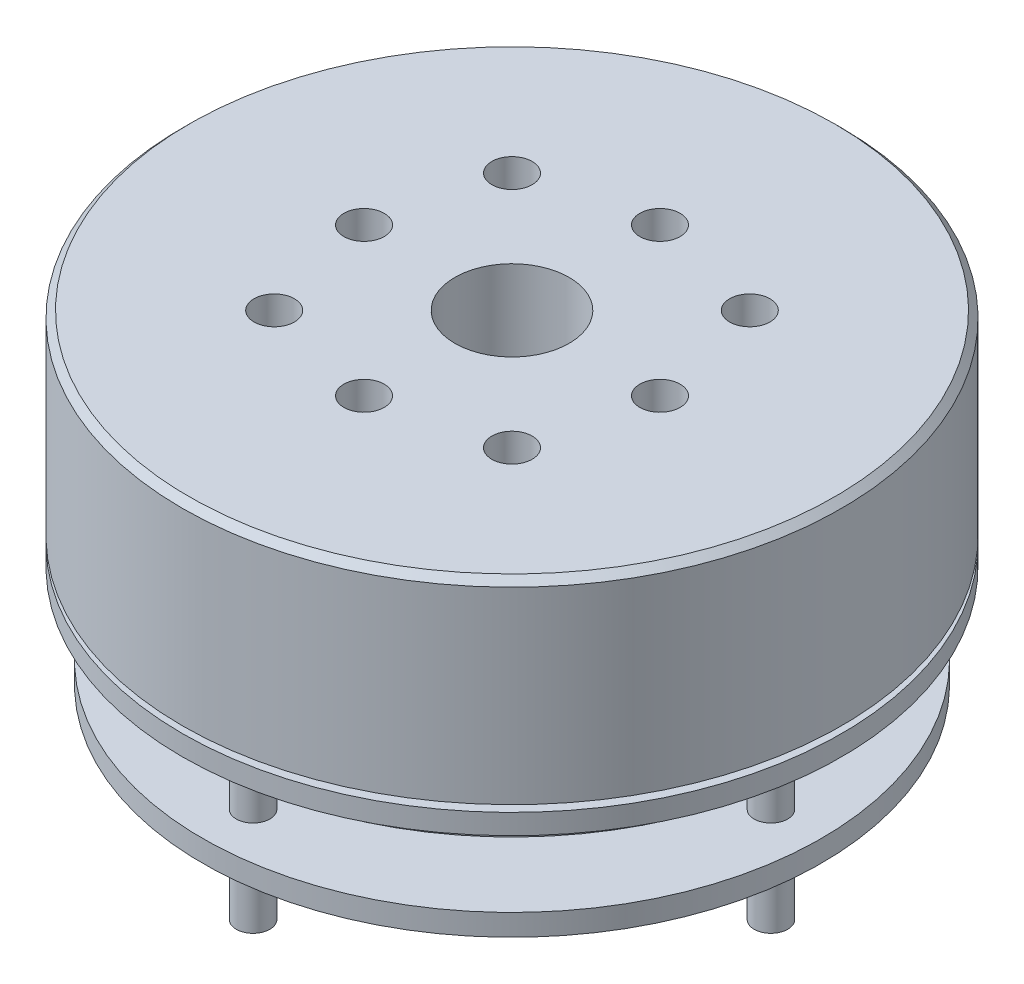
ISO-10303-21;
HEADER;
FILE_DESCRIPTION(('STEP AP214'),'2;1');
FILE_NAME('part.step','',(''),(''),'','','');
FILE_SCHEMA(('AUTOMOTIVE_DESIGN { 1 0 10303 214 1 1 1 1 }'));
ENDSEC;
DATA;
#1=APPLICATION_CONTEXT('core data for automotive mechanical design processes');
#2=APPLICATION_PROTOCOL_DEFINITION('international standard','automotive_design',2000,#1);
#3=PRODUCT_CONTEXT('',#1,'mechanical');
#4=PRODUCT('Part','Part','',(#3));
#5=PRODUCT_RELATED_PRODUCT_CATEGORY('part','',(#4));
#6=PRODUCT_DEFINITION_FORMATION('','',#4);
#7=PRODUCT_DEFINITION_CONTEXT('part definition',#1,'design');
#8=PRODUCT_DEFINITION('design','',#6,#7);
#9=PRODUCT_DEFINITION_SHAPE('','',#8);
#10=(LENGTH_UNIT() NAMED_UNIT(*) SI_UNIT(.MILLI.,.METRE.));
#11=(NAMED_UNIT(*) PLANE_ANGLE_UNIT() SI_UNIT($,.RADIAN.));
#12=(NAMED_UNIT(*) SI_UNIT($,.STERADIAN.) SOLID_ANGLE_UNIT());
#13=UNCERTAINTY_MEASURE_WITH_UNIT(LENGTH_MEASURE(1.E-05),#10,'distance_accuracy_value','');
#14=(GEOMETRIC_REPRESENTATION_CONTEXT(3) GLOBAL_UNCERTAINTY_ASSIGNED_CONTEXT((#13)) GLOBAL_UNIT_ASSIGNED_CONTEXT((#10,
#11,#12)) REPRESENTATION_CONTEXT('',''));
#15=CARTESIAN_POINT('',(0.,0.,0.));
#16=DIRECTION('',(0.,0.,1.));
#17=DIRECTION('',(1.,0.,0.));
#18=AXIS2_PLACEMENT_3D('',#15,#16,#17);
#19=CARTESIAN_POINT('',(0.,3.1,0.));
#20=DIRECTION('',(0.,-1.,0.));
#21=DIRECTION('',(0.,0.,-1.));
#22=AXIS2_PLACEMENT_3D('',#19,#20,#21);
#23=PLANE('',#22);
#24=CARTESIAN_POINT('',(0.,3.1,0.));
#25=DIRECTION('',(0.,-1.,0.));
#26=DIRECTION('',(0.,0.,-1.));
#27=AXIS2_PLACEMENT_3D('',#24,#25,#26);
#28=CIRCLE('',#27,8.3);
#29=CARTESIAN_POINT('',(0.,3.1,-8.3));
#30=VERTEX_POINT('',#29);
#31=EDGE_CURVE('E10',#30,#30,#28,.T.);
#32=ORIENTED_EDGE('',*,*,#31,.T.);
#33=EDGE_LOOP('',(#32));
#34=FACE_BOUND('',#33,.T.);
#35=ADVANCED_FACE('F31',(#34),#23,.T.);
#36=CARTESIAN_POINT('',(0.,4.54529667582957,0.));
#37=DIRECTION('',(0.,-1.,0.));
#38=DIRECTION('',(0.,0.,-1.));
#39=AXIS2_PLACEMENT_3D('',#36,#37,#38);
#40=CYLINDRICAL_SURFACE('',#39,8.3);
#41=CARTESIAN_POINT('',(0.,4.1,0.));
#42=DIRECTION('',(0.,-1.,0.));
#43=DIRECTION('',(0.,0.,-1.));
#44=AXIS2_PLACEMENT_3D('',#41,#42,#43);
#45=CIRCLE('',#44,8.3);
#46=CARTESIAN_POINT('',(0.,4.1,-8.3));
#47=VERTEX_POINT('',#46);
#48=EDGE_CURVE('E37',#47,#47,#45,.T.);
#49=ORIENTED_EDGE('',*,*,#48,.T.);
#50=EDGE_LOOP('',(#49));
#51=FACE_BOUND('',#50,.T.);
#52=ORIENTED_EDGE('',*,*,#31,.F.);
#53=EDGE_LOOP('',(#52));
#54=FACE_BOUND('',#53,.T.);
#55=ADVANCED_FACE('F221',(#51,#54),#40,.T.);
#56=CARTESIAN_POINT('',(22.5,4.1,0.));
#57=DIRECTION('',(0.,-1.,0.));
#58=DIRECTION('',(0.,0.,-1.));
#59=AXIS2_PLACEMENT_3D('',#56,#57,#58);
#60=PLANE('',#59);
#61=CARTESIAN_POINT('',(-19.2499999999995,4.1,-5.47117906535277E-13));
#62=DIRECTION('',(0.,-1.,0.));
#63=DIRECTION('',(0.,0.,-1.));
#64=AXIS2_PLACEMENT_3D('',#61,#62,#63);
#65=CIRCLE('',#64,1.25000000000088);
#66=CARTESIAN_POINT('',(-19.2499999999995,4.1,-1.25000000000142));
#67=VERTEX_POINT('',#66);
#68=EDGE_CURVE('E144',#67,#67,#65,.T.);
#69=ORIENTED_EDGE('',*,*,#68,.F.);
#70=EDGE_LOOP('',(#69));
#71=FACE_BOUND('',#70,.T.);
#72=CARTESIAN_POINT('',(1.08952092289384E-12,4.1,-19.25));
#73=DIRECTION('',(0.,-1.,0.));
#74=DIRECTION('',(0.,0.,-1.));
#75=AXIS2_PLACEMENT_3D('',#72,#73,#74);
#76=CIRCLE('',#75,1.25000000000117);
#77=CARTESIAN_POINT('',(1.08952092289384E-12,4.1,-20.5000000000012));
#78=VERTEX_POINT('',#77);
#79=EDGE_CURVE('E138',#78,#78,#76,.T.);
#80=ORIENTED_EDGE('',*,*,#79,.F.);
#81=EDGE_LOOP('',(#80));
#82=FACE_BOUND('',#81,.T.);
#83=CARTESIAN_POINT('',(19.2500000000005,4.1,5.44760461446919E-13));
#84=DIRECTION('',(0.,-1.,0.));
#85=DIRECTION('',(0.,0.,-1.));
#86=AXIS2_PLACEMENT_3D('',#83,#84,#85);
#87=CIRCLE('',#86,1.25000000000043);
#88=CARTESIAN_POINT('',(19.2500000000005,4.1,-1.24999999999988));
#89=VERTEX_POINT('',#88);
#90=EDGE_CURVE('E132',#89,#89,#87,.T.);
#91=ORIENTED_EDGE('',*,*,#90,.F.);
#92=EDGE_LOOP('',(#91));
#93=FACE_BOUND('',#92,.T.);
#94=CARTESIAN_POINT('',(0.,4.1,19.25));
#95=DIRECTION('',(0.,-1.,0.));
#96=DIRECTION('',(0.,0.,-1.));
#97=AXIS2_PLACEMENT_3D('',#94,#95,#96);
#98=CIRCLE('',#97,1.25);
#99=CARTESIAN_POINT('',(0.,4.1,18.));
#100=VERTEX_POINT('',#99);
#101=EDGE_CURVE('E126',#100,#100,#98,.T.);
#102=ORIENTED_EDGE('',*,*,#101,.F.);
#103=EDGE_LOOP('',(#102));
#104=FACE_BOUND('',#103,.T.);
#105=CARTESIAN_POINT('',(0.,4.1,0.));
#106=DIRECTION('',(0.,-1.,0.));
#107=DIRECTION('',(0.,0.,-1.));
#108=AXIS2_PLACEMENT_3D('',#105,#106,#107);
#109=CIRCLE('',#108,22.5);
#110=CARTESIAN_POINT('',(0.,4.1,-22.5));
#111=VERTEX_POINT('',#110);
#112=EDGE_CURVE('E41',#111,#111,#109,.T.);
#113=ORIENTED_EDGE('',*,*,#112,.T.);
#114=EDGE_LOOP('',(#113));
#115=FACE_BOUND('',#114,.T.);
#116=ORIENTED_EDGE('',*,*,#48,.F.);
#117=EDGE_LOOP('',(#116));
#118=FACE_BOUND('',#117,.T.);
#119=ADVANCED_FACE('F225',(#71,#82,#93,#104,#115,#118),#60,.T.);
#120=CARTESIAN_POINT('',(0.,4.54529667582957,0.));
#121=DIRECTION('',(0.,-1.,0.));
#122=DIRECTION('',(0.,0.,-1.));
#123=AXIS2_PLACEMENT_3D('',#120,#121,#122);
#124=CYLINDRICAL_SURFACE('',#123,22.5);
#125=CARTESIAN_POINT('',(0.,5.6,0.));
#126=DIRECTION('',(0.,-1.,0.));
#127=DIRECTION('',(0.,0.,-1.));
#128=AXIS2_PLACEMENT_3D('',#125,#126,#127);
#129=CIRCLE('',#128,22.5);
#130=CARTESIAN_POINT('',(0.,5.6,-22.5));
#131=VERTEX_POINT('',#130);
#132=EDGE_CURVE('E45',#131,#131,#129,.T.);
#133=ORIENTED_EDGE('',*,*,#132,.T.);
#134=EDGE_LOOP('',(#133));
#135=FACE_BOUND('',#134,.T.);
#136=ORIENTED_EDGE('',*,*,#112,.F.);
#137=EDGE_LOOP('',(#136));
#138=FACE_BOUND('',#137,.T.);
#139=ADVANCED_FACE('F229',(#135,#138),#124,.T.);
#140=CARTESIAN_POINT('',(24.5,5.6,0.));
#141=DIRECTION('',(0.,-1.,0.));
#142=DIRECTION('',(0.,0.,-1.));
#143=AXIS2_PLACEMENT_3D('',#140,#141,#142);
#144=PLANE('',#143);
#145=CARTESIAN_POINT('',(0.,5.6,0.));
#146=DIRECTION('',(0.,-1.,0.));
#147=DIRECTION('',(0.,0.,-1.));
#148=AXIS2_PLACEMENT_3D('',#145,#146,#147);
#149=CIRCLE('',#148,24.5);
#150=CARTESIAN_POINT('',(0.,5.6,-24.5));
#151=VERTEX_POINT('',#150);
#152=EDGE_CURVE('E50',#151,#151,#149,.T.);
#153=ORIENTED_EDGE('',*,*,#152,.T.);
#154=EDGE_LOOP('',(#153));
#155=FACE_BOUND('',#154,.T.);
#156=ORIENTED_EDGE('',*,*,#132,.F.);
#157=EDGE_LOOP('',(#156));
#158=FACE_BOUND('',#157,.T.);
#159=ADVANCED_FACE('F236',(#155,#158),#144,.T.);
#160=CARTESIAN_POINT('',(0.,4.54529667582957,0.));
#161=DIRECTION('',(0.,-1.,0.));
#162=DIRECTION('',(0.,0.,-1.));
#163=AXIS2_PLACEMENT_3D('',#160,#161,#162);
#164=CYLINDRICAL_SURFACE('',#163,24.5);
#165=CARTESIAN_POINT('',(0.,7.1,0.));
#166=DIRECTION('',(0.,-1.,0.));
#167=DIRECTION('',(0.,0.,-1.));
#168=AXIS2_PLACEMENT_3D('',#165,#166,#167);
#169=CIRCLE('',#168,24.5);
#170=CARTESIAN_POINT('',(0.,7.1,-24.5));
#171=VERTEX_POINT('',#170);
#172=EDGE_CURVE('E53',#171,#171,#169,.T.);
#173=ORIENTED_EDGE('',*,*,#172,.T.);
#174=EDGE_LOOP('',(#173));
#175=FACE_BOUND('',#174,.T.);
#176=ORIENTED_EDGE('',*,*,#152,.F.);
#177=EDGE_LOOP('',(#176));
#178=FACE_BOUND('',#177,.T.);
#179=ADVANCED_FACE('F240',(#175,#178),#164,.T.);
#180=CARTESIAN_POINT('',(23.5,7.10000000000001,0.));
#181=DIRECTION('',(0.,1.,0.));
#182=DIRECTION('',(0.,0.,1.));
#183=AXIS2_PLACEMENT_3D('',#180,#181,#182);
#184=PLANE('',#183);
#185=CARTESIAN_POINT('',(0.,7.10000000000001,0.));
#186=DIRECTION('',(0.,-1.,0.));
#187=DIRECTION('',(0.,0.,-1.));
#188=AXIS2_PLACEMENT_3D('',#185,#186,#187);
#189=CIRCLE('',#188,23.5);
#190=CARTESIAN_POINT('',(0.,7.10000000000001,-23.5));
#191=VERTEX_POINT('',#190);
#192=EDGE_CURVE('E56',#191,#191,#189,.T.);
#193=ORIENTED_EDGE('',*,*,#192,.T.);
#194=EDGE_LOOP('',(#193));
#195=FACE_BOUND('',#194,.T.);
#196=ORIENTED_EDGE('',*,*,#172,.F.);
#197=EDGE_LOOP('',(#196));
#198=FACE_BOUND('',#197,.T.);
#199=ADVANCED_FACE('F244',(#195,#198),#184,.T.);
#200=CARTESIAN_POINT('',(0.,4.54529667582957,0.));
#201=DIRECTION('',(0.,-1.,0.));
#202=DIRECTION('',(0.,0.,-1.));
#203=AXIS2_PLACEMENT_3D('',#200,#201,#202);
#204=CYLINDRICAL_SURFACE('',#203,23.5);
#205=CARTESIAN_POINT('',(0.,7.6,0.));
#206=DIRECTION('',(0.,-1.,0.));
#207=DIRECTION('',(0.,0.,-1.));
#208=AXIS2_PLACEMENT_3D('',#205,#206,#207);
#209=CIRCLE('',#208,23.5);
#210=CARTESIAN_POINT('',(0.,7.6,-23.5));
#211=VERTEX_POINT('',#210);
#212=EDGE_CURVE('E59',#211,#211,#209,.T.);
#213=ORIENTED_EDGE('',*,*,#212,.T.);
#214=EDGE_LOOP('',(#213));
#215=FACE_BOUND('',#214,.T.);
#216=ORIENTED_EDGE('',*,*,#192,.F.);
#217=EDGE_LOOP('',(#216));
#218=FACE_BOUND('',#217,.T.);
#219=ADVANCED_FACE('F248',(#215,#218),#204,.T.);
#220=CARTESIAN_POINT('',(24.5,7.6,0.));
#221=DIRECTION('',(0.,-1.,0.));
#222=DIRECTION('',(0.,0.,-1.));
#223=AXIS2_PLACEMENT_3D('',#220,#221,#222);
#224=PLANE('',#223);
#225=CARTESIAN_POINT('',(0.,7.6,0.));
#226=DIRECTION('',(0.,-1.,0.));
#227=DIRECTION('',(0.,0.,-1.));
#228=AXIS2_PLACEMENT_3D('',#225,#226,#227);
#229=CIRCLE('',#228,24.5);
#230=CARTESIAN_POINT('',(0.,7.6,-24.5));
#231=VERTEX_POINT('',#230);
#232=EDGE_CURVE('E62',#231,#231,#229,.T.);
#233=ORIENTED_EDGE('',*,*,#232,.T.);
#234=EDGE_LOOP('',(#233));
#235=FACE_BOUND('',#234,.T.);
#236=ORIENTED_EDGE('',*,*,#212,.F.);
#237=EDGE_LOOP('',(#236));
#238=FACE_BOUND('',#237,.T.);
#239=ADVANCED_FACE('F252',(#235,#238),#224,.T.);
#240=CARTESIAN_POINT('',(0.,4.54529667582957,0.));
#241=DIRECTION('',(0.,-1.,0.));
#242=DIRECTION('',(0.,0.,-1.));
#243=AXIS2_PLACEMENT_3D('',#240,#241,#242);
#244=CYLINDRICAL_SURFACE('',#243,24.5);
#245=CARTESIAN_POINT('',(0.,21.6,0.));
#246=DIRECTION('',(0.,-1.,0.));
#247=DIRECTION('',(0.,0.,-1.));
#248=AXIS2_PLACEMENT_3D('',#245,#246,#247);
#249=CIRCLE('',#248,24.5);
#250=CARTESIAN_POINT('',(0.,21.6,-24.5));
#251=VERTEX_POINT('',#250);
#252=EDGE_CURVE('E65',#251,#251,#249,.T.);
#253=ORIENTED_EDGE('',*,*,#252,.T.);
#254=EDGE_LOOP('',(#253));
#255=FACE_BOUND('',#254,.T.);
#256=ORIENTED_EDGE('',*,*,#232,.F.);
#257=EDGE_LOOP('',(#256));
#258=FACE_BOUND('',#257,.T.);
#259=ADVANCED_FACE('F256',(#255,#258),#244,.T.);
#260=CARTESIAN_POINT('',(0.,21.6,0.));
#261=DIRECTION('',(0.,-1.,0.));
#262=DIRECTION('',(0.,0.,-1.));
#263=AXIS2_PLACEMENT_3D('',#260,#261,#262);
#264=CONICAL_SURFACE('',#263,24.5,0.785398163397452);
#265=CARTESIAN_POINT('',(0.,22.1,0.));
#266=DIRECTION('',(0.,-1.,0.));
#267=DIRECTION('',(0.,0.,-1.));
#268=AXIS2_PLACEMENT_3D('',#265,#266,#267);
#269=CIRCLE('',#268,24.);
#270=CARTESIAN_POINT('',(0.,22.1,-24.));
#271=VERTEX_POINT('',#270);
#272=EDGE_CURVE('E68',#271,#271,#269,.T.);
#273=ORIENTED_EDGE('',*,*,#272,.T.);
#274=EDGE_LOOP('',(#273));
#275=FACE_BOUND('',#274,.T.);
#276=ORIENTED_EDGE('',*,*,#252,.F.);
#277=EDGE_LOOP('',(#276));
#278=FACE_BOUND('',#277,.T.);
#279=ADVANCED_FACE('F260',(#275,#278),#264,.T.);
#280=CARTESIAN_POINT('',(24.,22.1,0.));
#281=DIRECTION('',(0.,1.,0.));
#282=DIRECTION('',(0.,0.,1.));
#283=AXIS2_PLACEMENT_3D('',#280,#281,#282);
#284=PLANE('',#283);
#285=CARTESIAN_POINT('',(0.,22.1,0.));
#286=DIRECTION('',(0.,1.,0.));
#287=DIRECTION('',(0.,0.,1.));
#288=AXIS2_PLACEMENT_3D('',#285,#286,#287);
#289=CIRCLE('',#288,4.25);
#290=CARTESIAN_POINT('',(0.,22.1,4.25));
#291=VERTEX_POINT('',#290);
#292=EDGE_CURVE('E120',#291,#291,#289,.T.);
#293=ORIENTED_EDGE('',*,*,#292,.F.);
#294=EDGE_LOOP('',(#293));
#295=FACE_BOUND('',#294,.T.);
#296=CARTESIAN_POINT('',(8.83883476483186,22.1,-8.83883476483183));
#297=DIRECTION('',(0.,1.,0.));
#298=DIRECTION('',(0.,0.,1.));
#299=AXIS2_PLACEMENT_3D('',#296,#297,#298);
#300=CIRCLE('',#299,1.5);
#301=CARTESIAN_POINT('',(8.83883476483186,22.1,-7.33883476483183));
#302=VERTEX_POINT('',#301);
#303=EDGE_CURVE('E90',#302,#302,#300,.T.);
#304=ORIENTED_EDGE('',*,*,#303,.F.);
#305=EDGE_LOOP('',(#304));
#306=FACE_BOUND('',#305,.T.);
#307=CARTESIAN_POINT('',(-10.9999999999997,22.1,3.12638803734444E-13));
#308=DIRECTION('',(0.,1.,0.));
#309=DIRECTION('',(0.,0.,1.));
#310=AXIS2_PLACEMENT_3D('',#307,#308,#309);
#311=CIRCLE('',#310,1.5000000000005);
#312=CARTESIAN_POINT('',(-10.9999999999997,22.1,1.50000000000081));
#313=VERTEX_POINT('',#312);
#314=EDGE_CURVE('E97',#313,#313,#311,.T.);
#315=ORIENTED_EDGE('',*,*,#314,.F.);
#316=EDGE_LOOP('',(#315));
#317=FACE_BOUND('',#316,.T.);
#318=CARTESIAN_POINT('',(6.22583384510764E-13,22.1,11.));
#319=DIRECTION('',(0.,1.,0.));
#320=DIRECTION('',(0.,0.,1.));
#321=AXIS2_PLACEMENT_3D('',#318,#319,#320);
#322=CIRCLE('',#321,1.50000000000067);
#323=CARTESIAN_POINT('',(6.22583384510764E-13,22.1,12.5000000000007));
#324=VERTEX_POINT('',#323);
#325=EDGE_CURVE('E78',#324,#324,#322,.T.);
#326=ORIENTED_EDGE('',*,*,#325,.F.);
#327=EDGE_LOOP('',(#326));
#328=FACE_BOUND('',#327,.T.);
#329=CARTESIAN_POINT('',(11.0000000000003,22.1,-3.11291692255382E-13));
#330=DIRECTION('',(0.,1.,0.));
#331=DIRECTION('',(0.,0.,1.));
#332=AXIS2_PLACEMENT_3D('',#329,#330,#331);
#333=CIRCLE('',#332,1.50000000000024);
#334=CARTESIAN_POINT('',(11.0000000000003,22.1,1.49999999999993));
#335=VERTEX_POINT('',#334);
#336=EDGE_CURVE('E85',#335,#335,#333,.T.);
#337=ORIENTED_EDGE('',*,*,#336,.F.);
#338=EDGE_LOOP('',(#337));
#339=FACE_BOUND('',#338,.T.);
#340=CARTESIAN_POINT('',(8.83883476483275,22.1,8.83883476483147));
#341=DIRECTION('',(0.,1.,0.));
#342=DIRECTION('',(0.,0.,1.));
#343=AXIS2_PLACEMENT_3D('',#340,#341,#342);
#344=CIRCLE('',#343,1.5);
#345=CARTESIAN_POINT('',(8.83883476483275,22.1,10.3388347648315));
#346=VERTEX_POINT('',#345);
#347=EDGE_CURVE('E115',#346,#346,#344,.T.);
#348=ORIENTED_EDGE('',*,*,#347,.F.);
#349=EDGE_LOOP('',(#348));
#350=FACE_BOUND('',#349,.T.);
#351=CARTESIAN_POINT('',(-8.83883476483094,22.1,8.83883476483222));
#352=DIRECTION('',(0.,1.,0.));
#353=DIRECTION('',(0.,0.,1.));
#354=AXIS2_PLACEMENT_3D('',#351,#352,#353);
#355=CIRCLE('',#354,1.5);
#356=CARTESIAN_POINT('',(-8.83883476483094,22.1,10.3388347648322));
#357=VERTEX_POINT('',#356);
#358=EDGE_CURVE('E109',#357,#357,#355,.T.);
#359=ORIENTED_EDGE('',*,*,#358,.F.);
#360=EDGE_LOOP('',(#359));
#361=FACE_BOUND('',#360,.T.);
#362=CARTESIAN_POINT('',(-8.83883476483169,22.1,-8.83883476483147));
#363=DIRECTION('',(0.,1.,0.));
#364=DIRECTION('',(0.,0.,1.));
#365=AXIS2_PLACEMENT_3D('',#362,#363,#364);
#366=CIRCLE('',#365,1.5);
#367=CARTESIAN_POINT('',(-8.83883476483169,22.1,-7.33883476483147));
#368=VERTEX_POINT('',#367);
#369=EDGE_CURVE('E102',#368,#368,#366,.T.);
#370=ORIENTED_EDGE('',*,*,#369,.F.);
#371=EDGE_LOOP('',(#370));
#372=FACE_BOUND('',#371,.T.);
#373=CARTESIAN_POINT('',(0.,22.1,-11.));
#374=DIRECTION('',(0.,1.,0.));
#375=DIRECTION('',(0.,0.,1.));
#376=AXIS2_PLACEMENT_3D('',#373,#374,#375);
#377=CIRCLE('',#376,1.5);
#378=CARTESIAN_POINT('',(0.,22.1,-9.5));
#379=VERTEX_POINT('',#378);
#380=EDGE_CURVE('E72',#379,#379,#377,.T.);
#381=ORIENTED_EDGE('',*,*,#380,.F.);
#382=EDGE_LOOP('',(#381));
#383=FACE_BOUND('',#382,.T.);
#384=ORIENTED_EDGE('',*,*,#272,.F.);
#385=EDGE_LOOP('',(#384));
#386=FACE_BOUND('',#385,.T.);
#387=ADVANCED_FACE('F264',(#295,#306,#317,#328,#339,#350,#361,#372,#383,#386),#284,.T.);
#388=CARTESIAN_POINT('',(0.,19.1,-11.));
#389=DIRECTION('',(0.,1.,0.));
#390=DIRECTION('',(0.,0.,1.));
#391=AXIS2_PLACEMENT_3D('',#388,#389,#390);
#392=CYLINDRICAL_SURFACE('',#391,1.5);
#393=CARTESIAN_POINT('',(0.,19.1,-11.));
#394=DIRECTION('',(0.,1.,0.));
#395=DIRECTION('',(0.,0.,1.));
#396=AXIS2_PLACEMENT_3D('',#393,#394,#395);
#397=CIRCLE('',#396,1.5);
#398=CARTESIAN_POINT('',(0.,19.1,-9.5));
#399=VERTEX_POINT('',#398);
#400=EDGE_CURVE('E71',#399,#399,#397,.T.);
#401=ORIENTED_EDGE('',*,*,#400,.F.);
#402=EDGE_LOOP('',(#401));
#403=FACE_BOUND('',#402,.T.);
#404=ORIENTED_EDGE('',*,*,#380,.T.);
#405=EDGE_LOOP('',(#404));
#406=FACE_BOUND('',#405,.T.);
#407=ADVANCED_FACE('F268',(#403,#406),#392,.F.);
#408=CARTESIAN_POINT('',(0.,19.1,-11.));
#409=DIRECTION('',(0.,1.,0.));
#410=DIRECTION('',(0.,0.,1.));
#411=AXIS2_PLACEMENT_3D('',#408,#409,#410);
#412=PLANE('',#411);
#413=ORIENTED_EDGE('',*,*,#400,.T.);
#414=EDGE_LOOP('',(#413));
#415=FACE_BOUND('',#414,.T.);
#416=ADVANCED_FACE('F272',(#415),#412,.T.);
#417=CARTESIAN_POINT('',(-8.83883476483169,19.1,-8.83883476483147));
#418=DIRECTION('',(0.,1.,0.));
#419=DIRECTION('',(0.,0.,1.));
#420=AXIS2_PLACEMENT_3D('',#417,#418,#419);
#421=CYLINDRICAL_SURFACE('',#420,1.5);
#422=CARTESIAN_POINT('',(-8.83883476483169,19.1,-8.83883476483147));
#423=DIRECTION('',(0.,1.,0.));
#424=DIRECTION('',(0.,0.,1.));
#425=AXIS2_PLACEMENT_3D('',#422,#423,#424);
#426=CIRCLE('',#425,1.5);
#427=CARTESIAN_POINT('',(-8.83883476483169,19.1,-7.33883476483147));
#428=VERTEX_POINT('',#427);
#429=EDGE_CURVE('E105',#428,#428,#426,.T.);
#430=ORIENTED_EDGE('',*,*,#429,.F.);
#431=EDGE_LOOP('',(#430));
#432=FACE_BOUND('',#431,.T.);
#433=ORIENTED_EDGE('',*,*,#369,.T.);
#434=EDGE_LOOP('',(#433));
#435=FACE_BOUND('',#434,.T.);
#436=ADVANCED_FACE('F276',(#432,#435),#421,.F.);
#437=CARTESIAN_POINT('',(-8.83883476483169,19.1,-8.83883476483147));
#438=DIRECTION('',(0.,1.,0.));
#439=DIRECTION('',(0.,0.,1.));
#440=AXIS2_PLACEMENT_3D('',#437,#438,#439);
#441=PLANE('',#440);
#442=ORIENTED_EDGE('',*,*,#429,.T.);
#443=EDGE_LOOP('',(#442));
#444=FACE_BOUND('',#443,.T.);
#445=ADVANCED_FACE('F314',(#444),#441,.T.);
#446=CARTESIAN_POINT('',(-8.83883476483094,19.1,8.83883476483222));
#447=DIRECTION('',(0.,1.,0.));
#448=DIRECTION('',(0.,0.,1.));
#449=AXIS2_PLACEMENT_3D('',#446,#447,#448);
#450=CYLINDRICAL_SURFACE('',#449,1.5);
#451=CARTESIAN_POINT('',(-8.83883476483094,19.1,8.83883476483222));
#452=DIRECTION('',(0.,1.,0.));
#453=DIRECTION('',(0.,0.,1.));
#454=AXIS2_PLACEMENT_3D('',#451,#452,#453);
#455=CIRCLE('',#454,1.5);
#456=CARTESIAN_POINT('',(-8.83883476483094,19.1,10.3388347648322));
#457=VERTEX_POINT('',#456);
#458=EDGE_CURVE('E112',#457,#457,#455,.T.);
#459=ORIENTED_EDGE('',*,*,#458,.F.);
#460=EDGE_LOOP('',(#459));
#461=FACE_BOUND('',#460,.T.);
#462=ORIENTED_EDGE('',*,*,#358,.T.);
#463=EDGE_LOOP('',(#462));
#464=FACE_BOUND('',#463,.T.);
#465=ADVANCED_FACE('F318',(#461,#464),#450,.F.);
#466=CARTESIAN_POINT('',(-8.83883476483094,19.1,8.83883476483222));
#467=DIRECTION('',(0.,1.,0.));
#468=DIRECTION('',(0.,0.,1.));
#469=AXIS2_PLACEMENT_3D('',#466,#467,#468);
#470=PLANE('',#469);
#471=ORIENTED_EDGE('',*,*,#458,.T.);
#472=EDGE_LOOP('',(#471));
#473=FACE_BOUND('',#472,.T.);
#474=ADVANCED_FACE('F322',(#473),#470,.T.);
#475=CARTESIAN_POINT('',(8.83883476483275,19.1,8.83883476483147));
#476=DIRECTION('',(0.,1.,0.));
#477=DIRECTION('',(0.,0.,1.));
#478=AXIS2_PLACEMENT_3D('',#475,#476,#477);
#479=CYLINDRICAL_SURFACE('',#478,1.5);
#480=CARTESIAN_POINT('',(8.83883476483275,19.1,8.83883476483147));
#481=DIRECTION('',(0.,1.,0.));
#482=DIRECTION('',(0.,0.,1.));
#483=AXIS2_PLACEMENT_3D('',#480,#481,#482);
#484=CIRCLE('',#483,1.5);
#485=CARTESIAN_POINT('',(8.83883476483275,19.1,10.3388347648315));
#486=VERTEX_POINT('',#485);
#487=EDGE_CURVE('E94',#486,#486,#484,.T.);
#488=ORIENTED_EDGE('',*,*,#487,.F.);
#489=EDGE_LOOP('',(#488));
#490=FACE_BOUND('',#489,.T.);
#491=ORIENTED_EDGE('',*,*,#347,.T.);
#492=EDGE_LOOP('',(#491));
#493=FACE_BOUND('',#492,.T.);
#494=ADVANCED_FACE('F326',(#490,#493),#479,.F.);
#495=CARTESIAN_POINT('',(8.83883476483275,19.1,8.83883476483147));
#496=DIRECTION('',(0.,1.,0.));
#497=DIRECTION('',(0.,0.,1.));
#498=AXIS2_PLACEMENT_3D('',#495,#496,#497);
#499=PLANE('',#498);
#500=ORIENTED_EDGE('',*,*,#487,.T.);
#501=EDGE_LOOP('',(#500));
#502=FACE_BOUND('',#501,.T.);
#503=ADVANCED_FACE('F291',(#502),#499,.T.);
#504=CARTESIAN_POINT('',(11.0000000000003,19.1,-3.11291692255382E-13));
#505=DIRECTION('',(0.,1.,0.));
#506=DIRECTION('',(0.,0.,1.));
#507=AXIS2_PLACEMENT_3D('',#504,#505,#506);
#508=CYLINDRICAL_SURFACE('',#507,1.50000000000024);
#509=CARTESIAN_POINT('',(11.0000000000003,19.1,-3.11291692255382E-13));
#510=DIRECTION('',(0.,1.,0.));
#511=DIRECTION('',(0.,0.,1.));
#512=AXIS2_PLACEMENT_3D('',#509,#510,#511);
#513=CIRCLE('',#512,1.50000000000024);
#514=CARTESIAN_POINT('',(11.0000000000003,19.1,1.49999999999993));
#515=VERTEX_POINT('',#514);
#516=EDGE_CURVE('E75',#515,#515,#513,.T.);
#517=ORIENTED_EDGE('',*,*,#516,.F.);
#518=EDGE_LOOP('',(#517));
#519=FACE_BOUND('',#518,.T.);
#520=ORIENTED_EDGE('',*,*,#336,.T.);
#521=EDGE_LOOP('',(#520));
#522=FACE_BOUND('',#521,.T.);
#523=ADVANCED_FACE('F288',(#519,#522),#508,.F.);
#524=CARTESIAN_POINT('',(11.0000000000003,19.1,-3.11291692255382E-13));
#525=DIRECTION('',(0.,1.,0.));
#526=DIRECTION('',(0.,0.,1.));
#527=AXIS2_PLACEMENT_3D('',#524,#525,#526);
#528=PLANE('',#527);
#529=ORIENTED_EDGE('',*,*,#516,.T.);
#530=EDGE_LOOP('',(#529));
#531=FACE_BOUND('',#530,.T.);
#532=ADVANCED_FACE('F282',(#531),#528,.T.);
#533=CARTESIAN_POINT('',(6.22583384510764E-13,19.1,11.));
#534=DIRECTION('',(0.,1.,0.));
#535=DIRECTION('',(0.,0.,1.));
#536=AXIS2_PLACEMENT_3D('',#533,#534,#535);
#537=CYLINDRICAL_SURFACE('',#536,1.50000000000067);
#538=CARTESIAN_POINT('',(6.22583384510764E-13,19.1,11.));
#539=DIRECTION('',(0.,1.,0.));
#540=DIRECTION('',(0.,0.,1.));
#541=AXIS2_PLACEMENT_3D('',#538,#539,#540);
#542=CIRCLE('',#541,1.50000000000067);
#543=CARTESIAN_POINT('',(6.22583384510764E-13,19.1,12.5000000000007));
#544=VERTEX_POINT('',#543);
#545=EDGE_CURVE('E81',#544,#544,#542,.T.);
#546=ORIENTED_EDGE('',*,*,#545,.F.);
#547=EDGE_LOOP('',(#546));
#548=FACE_BOUND('',#547,.T.);
#549=ORIENTED_EDGE('',*,*,#325,.T.);
#550=EDGE_LOOP('',(#549));
#551=FACE_BOUND('',#550,.T.);
#552=ADVANCED_FACE('F278',(#548,#551),#537,.F.);
#553=CARTESIAN_POINT('',(6.22583384510764E-13,19.1,11.));
#554=DIRECTION('',(0.,1.,0.));
#555=DIRECTION('',(0.,0.,1.));
#556=AXIS2_PLACEMENT_3D('',#553,#554,#555);
#557=PLANE('',#556);
#558=ORIENTED_EDGE('',*,*,#545,.T.);
#559=EDGE_LOOP('',(#558));
#560=FACE_BOUND('',#559,.T.);
#561=ADVANCED_FACE('F281',(#560),#557,.T.);
#562=CARTESIAN_POINT('',(-10.9999999999997,19.1,3.12638803734444E-13));
#563=DIRECTION('',(0.,1.,0.));
#564=DIRECTION('',(0.,0.,1.));
#565=AXIS2_PLACEMENT_3D('',#562,#563,#564);
#566=CYLINDRICAL_SURFACE('',#565,1.5000000000005);
#567=CARTESIAN_POINT('',(-10.9999999999997,19.1,3.12638803734444E-13));
#568=DIRECTION('',(0.,1.,0.));
#569=DIRECTION('',(0.,0.,1.));
#570=AXIS2_PLACEMENT_3D('',#567,#568,#569);
#571=CIRCLE('',#570,1.5000000000005);
#572=CARTESIAN_POINT('',(-10.9999999999997,19.1,1.50000000000081));
#573=VERTEX_POINT('',#572);
#574=EDGE_CURVE('E82',#573,#573,#571,.T.);
#575=ORIENTED_EDGE('',*,*,#574,.F.);
#576=EDGE_LOOP('',(#575));
#577=FACE_BOUND('',#576,.T.);
#578=ORIENTED_EDGE('',*,*,#314,.T.);
#579=EDGE_LOOP('',(#578));
#580=FACE_BOUND('',#579,.T.);
#581=ADVANCED_FACE('F286',(#577,#580),#566,.F.);
#582=CARTESIAN_POINT('',(-10.9999999999997,19.1,3.12638803734444E-13));
#583=DIRECTION('',(0.,1.,0.));
#584=DIRECTION('',(0.,0.,1.));
#585=AXIS2_PLACEMENT_3D('',#582,#583,#584);
#586=PLANE('',#585);
#587=ORIENTED_EDGE('',*,*,#574,.T.);
#588=EDGE_LOOP('',(#587));
#589=FACE_BOUND('',#588,.T.);
#590=ADVANCED_FACE('F300',(#589),#586,.T.);
#591=CARTESIAN_POINT('',(8.83883476483186,19.1,-8.83883476483183));
#592=DIRECTION('',(0.,1.,0.));
#593=DIRECTION('',(0.,0.,1.));
#594=AXIS2_PLACEMENT_3D('',#591,#592,#593);
#595=CYLINDRICAL_SURFACE('',#594,1.5);
#596=CARTESIAN_POINT('',(8.83883476483186,19.1,-8.83883476483183));
#597=DIRECTION('',(0.,1.,0.));
#598=DIRECTION('',(0.,0.,1.));
#599=AXIS2_PLACEMENT_3D('',#596,#597,#598);
#600=CIRCLE('',#599,1.5);
#601=CARTESIAN_POINT('',(8.83883476483186,19.1,-7.33883476483183));
#602=VERTEX_POINT('',#601);
#603=EDGE_CURVE('E93',#602,#602,#600,.T.);
#604=ORIENTED_EDGE('',*,*,#603,.F.);
#605=EDGE_LOOP('',(#604));
#606=FACE_BOUND('',#605,.T.);
#607=ORIENTED_EDGE('',*,*,#303,.T.);
#608=EDGE_LOOP('',(#607));
#609=FACE_BOUND('',#608,.T.);
#610=ADVANCED_FACE('F296',(#606,#609),#595,.F.);
#611=CARTESIAN_POINT('',(8.83883476483186,19.1,-8.83883476483183));
#612=DIRECTION('',(0.,1.,0.));
#613=DIRECTION('',(0.,0.,1.));
#614=AXIS2_PLACEMENT_3D('',#611,#612,#613);
#615=PLANE('',#614);
#616=ORIENTED_EDGE('',*,*,#603,.T.);
#617=EDGE_LOOP('',(#616));
#618=FACE_BOUND('',#617,.T.);
#619=ADVANCED_FACE('F299',(#618),#615,.T.);
#620=CARTESIAN_POINT('',(0.,4.1,0.));
#621=DIRECTION('',(0.,1.,0.));
#622=DIRECTION('',(0.,0.,1.));
#623=AXIS2_PLACEMENT_3D('',#620,#621,#622);
#624=CYLINDRICAL_SURFACE('',#623,4.25);
#625=CARTESIAN_POINT('',(0.,4.1,0.));
#626=DIRECTION('',(0.,1.,0.));
#627=DIRECTION('',(0.,0.,1.));
#628=AXIS2_PLACEMENT_3D('',#625,#626,#627);
#629=CIRCLE('',#628,4.25);
#630=CARTESIAN_POINT('',(0.,4.1,4.25));
#631=VERTEX_POINT('',#630);
#632=EDGE_CURVE('E106',#631,#631,#629,.T.);
#633=ORIENTED_EDGE('',*,*,#632,.F.);
#634=EDGE_LOOP('',(#633));
#635=FACE_BOUND('',#634,.T.);
#636=ORIENTED_EDGE('',*,*,#292,.T.);
#637=EDGE_LOOP('',(#636));
#638=FACE_BOUND('',#637,.T.);
#639=ADVANCED_FACE('F304',(#635,#638),#624,.F.);
#640=CARTESIAN_POINT('',(0.,4.1,0.));
#641=DIRECTION('',(0.,1.,0.));
#642=DIRECTION('',(0.,0.,1.));
#643=AXIS2_PLACEMENT_3D('',#640,#641,#642);
#644=PLANE('',#643);
#645=ORIENTED_EDGE('',*,*,#632,.T.);
#646=EDGE_LOOP('',(#645));
#647=FACE_BOUND('',#646,.T.);
#648=ADVANCED_FACE('F336',(#647),#644,.T.);
#649=CARTESIAN_POINT('',(0.,-0.399999999999996,19.25));
#650=DIRECTION('',(0.,1.,0.));
#651=DIRECTION('',(0.,0.,1.));
#652=AXIS2_PLACEMENT_3D('',#649,#650,#651);
#653=CYLINDRICAL_SURFACE('',#652,1.25);
#654=CARTESIAN_POINT('',(0.,-0.399999999999996,19.25));
#655=DIRECTION('',(0.,-1.,0.));
#656=DIRECTION('',(0.,0.,-1.));
#657=AXIS2_PLACEMENT_3D('',#654,#655,#656);
#658=CIRCLE('',#657,1.25);
#659=CARTESIAN_POINT('',(0.,-0.399999999999996,18.));
#660=VERTEX_POINT('',#659);
#661=EDGE_CURVE('E123',#660,#660,#658,.T.);
#662=ORIENTED_EDGE('',*,*,#661,.F.);
#663=EDGE_LOOP('',(#662));
#664=FACE_BOUND('',#663,.T.);
#665=ORIENTED_EDGE('',*,*,#101,.T.);
#666=EDGE_LOOP('',(#665));
#667=FACE_BOUND('',#666,.T.);
#668=ADVANCED_FACE('F340',(#664,#667),#653,.T.);
#669=CARTESIAN_POINT('',(19.2500000000005,-0.399999999999996,5.44760461446919E-13));
#670=DIRECTION('',(0.,1.,0.));
#671=DIRECTION('',(0.,0.,1.));
#672=AXIS2_PLACEMENT_3D('',#669,#670,#671);
#673=CYLINDRICAL_SURFACE('',#672,1.25000000000043);
#674=CARTESIAN_POINT('',(19.2500000000005,-0.399999999999996,5.44760461446919E-13));
#675=DIRECTION('',(0.,-1.,0.));
#676=DIRECTION('',(0.,0.,-1.));
#677=AXIS2_PLACEMENT_3D('',#674,#675,#676);
#678=CIRCLE('',#677,1.25000000000043);
#679=CARTESIAN_POINT('',(19.2500000000005,-0.399999999999996,-1.24999999999988));
#680=VERTEX_POINT('',#679);
#681=EDGE_CURVE('E129',#680,#680,#678,.T.);
#682=ORIENTED_EDGE('',*,*,#681,.F.);
#683=EDGE_LOOP('',(#682));
#684=FACE_BOUND('',#683,.T.);
#685=ORIENTED_EDGE('',*,*,#90,.T.);
#686=EDGE_LOOP('',(#685));
#687=FACE_BOUND('',#686,.T.);
#688=ADVANCED_FACE('F344',(#684,#687),#673,.T.);
#689=CARTESIAN_POINT('',(1.08952092289384E-12,-0.399999999999996,-19.25));
#690=DIRECTION('',(0.,1.,0.));
#691=DIRECTION('',(0.,0.,1.));
#692=AXIS2_PLACEMENT_3D('',#689,#690,#691);
#693=CYLINDRICAL_SURFACE('',#692,1.25000000000117);
#694=CARTESIAN_POINT('',(1.08952092289384E-12,-0.399999999999996,-19.25));
#695=DIRECTION('',(0.,-1.,0.));
#696=DIRECTION('',(0.,0.,-1.));
#697=AXIS2_PLACEMENT_3D('',#694,#695,#696);
#698=CIRCLE('',#697,1.25000000000117);
#699=CARTESIAN_POINT('',(1.08952092289384E-12,-0.399999999999996,-20.5000000000012));
#700=VERTEX_POINT('',#699);
#701=EDGE_CURVE('E135',#700,#700,#698,.T.);
#702=ORIENTED_EDGE('',*,*,#701,.F.);
#703=EDGE_LOOP('',(#702));
#704=FACE_BOUND('',#703,.T.);
#705=ORIENTED_EDGE('',*,*,#79,.T.);
#706=EDGE_LOOP('',(#705));
#707=FACE_BOUND('',#706,.T.);
#708=ADVANCED_FACE('F348',(#704,#707),#693,.T.);
#709=CARTESIAN_POINT('',(-19.2499999999995,-0.399999999999996,-5.47117906535277E-13));
#710=DIRECTION('',(0.,1.,0.));
#711=DIRECTION('',(0.,0.,1.));
#712=AXIS2_PLACEMENT_3D('',#709,#710,#711);
#713=CYLINDRICAL_SURFACE('',#712,1.25000000000088);
#714=CARTESIAN_POINT('',(-19.2499999999995,-0.399999999999996,-5.47117906535277E-13));
#715=DIRECTION('',(0.,-1.,0.));
#716=DIRECTION('',(0.,0.,-1.));
#717=AXIS2_PLACEMENT_3D('',#714,#715,#716);
#718=CIRCLE('',#717,1.25000000000088);
#719=CARTESIAN_POINT('',(-19.2499999999995,-0.399999999999996,-1.25000000000142));
#720=VERTEX_POINT('',#719);
#721=EDGE_CURVE('E141',#720,#720,#718,.T.);
#722=ORIENTED_EDGE('',*,*,#721,.F.);
#723=EDGE_LOOP('',(#722));
#724=FACE_BOUND('',#723,.T.);
#725=ORIENTED_EDGE('',*,*,#68,.T.);
#726=EDGE_LOOP('',(#725));
#727=FACE_BOUND('',#726,.T.);
#728=ADVANCED_FACE('F205',(#724,#727),#713,.T.);
#729=CARTESIAN_POINT('',(0.,-2.,0.));
#730=DIRECTION('',(0.,1.,0.));
#731=DIRECTION('',(0.,0.,1.));
#732=AXIS2_PLACEMENT_3D('',#729,#730,#731);
#733=CYLINDRICAL_SURFACE('',#732,23.);
#734=CARTESIAN_POINT('',(0.,-2.,0.));
#735=DIRECTION('',(0.,-1.,0.));
#736=DIRECTION('',(0.,0.,-1.));
#737=AXIS2_PLACEMENT_3D('',#734,#735,#736);
#738=CIRCLE('',#737,23.);
#739=CARTESIAN_POINT('',(0.,-2.,-23.));
#740=VERTEX_POINT('',#739);
#741=EDGE_CURVE('E147',#740,#740,#738,.T.);
#742=ORIENTED_EDGE('',*,*,#741,.F.);
#743=EDGE_LOOP('',(#742));
#744=FACE_BOUND('',#743,.T.);
#745=CARTESIAN_POINT('',(0.,-0.399999999999996,0.));
#746=DIRECTION('',(0.,-1.,0.));
#747=DIRECTION('',(0.,0.,-1.));
#748=AXIS2_PLACEMENT_3D('',#745,#746,#747);
#749=CIRCLE('',#748,23.);
#750=CARTESIAN_POINT('',(0.,-0.399999999999996,-23.));
#751=VERTEX_POINT('',#750);
#752=EDGE_CURVE('E150',#751,#751,#749,.T.);
#753=ORIENTED_EDGE('',*,*,#752,.T.);
#754=EDGE_LOOP('',(#753));
#755=FACE_BOUND('',#754,.T.);
#756=ADVANCED_FACE('F193',(#744,#755),#733,.T.);
#757=CARTESIAN_POINT('',(0.,-2.,0.));
#758=DIRECTION('',(0.,-1.,0.));
#759=DIRECTION('',(0.,0.,-1.));
#760=AXIS2_PLACEMENT_3D('',#757,#758,#759);
#761=PLANE('',#760);
#762=CARTESIAN_POINT('',(-19.2499999999995,-2.,-5.47117906535277E-13));
#763=DIRECTION('',(0.,-1.,0.));
#764=DIRECTION('',(0.,0.,-1.));
#765=AXIS2_PLACEMENT_3D('',#762,#763,#764);
#766=CIRCLE('',#765,1.25000000000088);
#767=CARTESIAN_POINT('',(-19.2499999999995,-2.,-1.25000000000142));
#768=VERTEX_POINT('',#767);
#769=EDGE_CURVE('E174',#768,#768,#766,.T.);
#770=ORIENTED_EDGE('',*,*,#769,.F.);
#771=EDGE_LOOP('',(#770));
#772=FACE_BOUND('',#771,.T.);
#773=CARTESIAN_POINT('',(1.08952092289384E-12,-2.,-19.25));
#774=DIRECTION('',(0.,-1.,0.));
#775=DIRECTION('',(0.,0.,-1.));
#776=AXIS2_PLACEMENT_3D('',#773,#774,#775);
#777=CIRCLE('',#776,1.25000000000117);
#778=CARTESIAN_POINT('',(1.08952092289384E-12,-2.,-20.5000000000012));
#779=VERTEX_POINT('',#778);
#780=EDGE_CURVE('E168',#779,#779,#777,.T.);
#781=ORIENTED_EDGE('',*,*,#780,.F.);
#782=EDGE_LOOP('',(#781));
#783=FACE_BOUND('',#782,.T.);
#784=CARTESIAN_POINT('',(19.2500000000005,-2.,5.44760461446919E-13));
#785=DIRECTION('',(0.,-1.,0.));
#786=DIRECTION('',(0.,0.,-1.));
#787=AXIS2_PLACEMENT_3D('',#784,#785,#786);
#788=CIRCLE('',#787,1.25000000000043);
#789=CARTESIAN_POINT('',(19.2500000000005,-2.,-1.24999999999988));
#790=VERTEX_POINT('',#789);
#791=EDGE_CURVE('E162',#790,#790,#788,.T.);
#792=ORIENTED_EDGE('',*,*,#791,.F.);
#793=EDGE_LOOP('',(#792));
#794=FACE_BOUND('',#793,.T.);
#795=CARTESIAN_POINT('',(0.,-2.,19.25));
#796=DIRECTION('',(0.,-1.,0.));
#797=DIRECTION('',(0.,0.,-1.));
#798=AXIS2_PLACEMENT_3D('',#795,#796,#797);
#799=CIRCLE('',#798,1.25);
#800=CARTESIAN_POINT('',(0.,-2.,18.));
#801=VERTEX_POINT('',#800);
#802=EDGE_CURVE('E156',#801,#801,#799,.T.);
#803=ORIENTED_EDGE('',*,*,#802,.F.);
#804=EDGE_LOOP('',(#803));
#805=FACE_BOUND('',#804,.T.);
#806=ORIENTED_EDGE('',*,*,#741,.T.);
#807=EDGE_LOOP('',(#806));
#808=FACE_BOUND('',#807,.T.);
#809=ADVANCED_FACE('F189',(#772,#783,#794,#805,#808),#761,.T.);
#810=CARTESIAN_POINT('',(0.,-0.399999999999996,0.));
#811=DIRECTION('',(0.,-1.,0.));
#812=DIRECTION('',(0.,0.,-1.));
#813=AXIS2_PLACEMENT_3D('',#810,#811,#812);
#814=PLANE('',#813);
#815=ORIENTED_EDGE('',*,*,#661,.T.);
#816=EDGE_LOOP('',(#815));
#817=FACE_BOUND('',#816,.T.);
#818=ORIENTED_EDGE('',*,*,#681,.T.);
#819=EDGE_LOOP('',(#818));
#820=FACE_BOUND('',#819,.T.);
#821=ORIENTED_EDGE('',*,*,#701,.T.);
#822=EDGE_LOOP('',(#821));
#823=FACE_BOUND('',#822,.T.);
#824=ORIENTED_EDGE('',*,*,#721,.T.);
#825=EDGE_LOOP('',(#824));
#826=FACE_BOUND('',#825,.T.);
#827=ORIENTED_EDGE('',*,*,#752,.F.);
#828=EDGE_LOOP('',(#827));
#829=FACE_BOUND('',#828,.T.);
#830=ADVANCED_FACE('F192',(#817,#820,#823,#826,#829),#814,.F.);
#831=CARTESIAN_POINT('',(0.,-7.5,19.25));
#832=DIRECTION('',(0.,1.,0.));
#833=DIRECTION('',(0.,0.,1.));
#834=AXIS2_PLACEMENT_3D('',#831,#832,#833);
#835=CYLINDRICAL_SURFACE('',#834,1.25);
#836=CARTESIAN_POINT('',(0.,-7.5,19.25));
#837=DIRECTION('',(0.,-1.,0.));
#838=DIRECTION('',(0.,0.,-1.));
#839=AXIS2_PLACEMENT_3D('',#836,#837,#838);
#840=CIRCLE('',#839,1.25);
#841=CARTESIAN_POINT('',(0.,-7.5,18.));
#842=VERTEX_POINT('',#841);
#843=EDGE_CURVE('E153',#842,#842,#840,.T.);
#844=ORIENTED_EDGE('',*,*,#843,.F.);
#845=EDGE_LOOP('',(#844));
#846=FACE_BOUND('',#845,.T.);
#847=ORIENTED_EDGE('',*,*,#802,.T.);
#848=EDGE_LOOP('',(#847));
#849=FACE_BOUND('',#848,.T.);
#850=ADVANCED_FACE('F210',(#846,#849),#835,.T.);
#851=CARTESIAN_POINT('',(0.,-7.5,19.25));
#852=DIRECTION('',(0.,-1.,0.));
#853=DIRECTION('',(0.,0.,-1.));
#854=AXIS2_PLACEMENT_3D('',#851,#852,#853);
#855=PLANE('',#854);
#856=ORIENTED_EDGE('',*,*,#843,.T.);
#857=EDGE_LOOP('',(#856));
#858=FACE_BOUND('',#857,.T.);
#859=ADVANCED_FACE('F216',(#858),#855,.T.);
#860=CARTESIAN_POINT('',(19.2500000000005,-7.5,5.44760461446919E-13));
#861=DIRECTION('',(0.,1.,0.));
#862=DIRECTION('',(0.,0.,1.));
#863=AXIS2_PLACEMENT_3D('',#860,#861,#862);
#864=CYLINDRICAL_SURFACE('',#863,1.25000000000043);
#865=CARTESIAN_POINT('',(19.2500000000005,-7.5,5.44760461446919E-13));
#866=DIRECTION('',(0.,-1.,0.));
#867=DIRECTION('',(0.,0.,-1.));
#868=AXIS2_PLACEMENT_3D('',#865,#866,#867);
#869=CIRCLE('',#868,1.25000000000043);
#870=CARTESIAN_POINT('',(19.2500000000005,-7.5,-1.24999999999988));
#871=VERTEX_POINT('',#870);
#872=EDGE_CURVE('E159',#871,#871,#869,.T.);
#873=ORIENTED_EDGE('',*,*,#872,.F.);
#874=EDGE_LOOP('',(#873));
#875=FACE_BOUND('',#874,.T.);
#876=ORIENTED_EDGE('',*,*,#791,.T.);
#877=EDGE_LOOP('',(#876));
#878=FACE_BOUND('',#877,.T.);
#879=ADVANCED_FACE('F401',(#875,#878),#864,.T.);
#880=CARTESIAN_POINT('',(19.2500000000005,-7.5,5.44760461446919E-13));
#881=DIRECTION('',(0.,-1.,0.));
#882=DIRECTION('',(0.,0.,-1.));
#883=AXIS2_PLACEMENT_3D('',#880,#881,#882);
#884=PLANE('',#883);
#885=ORIENTED_EDGE('',*,*,#872,.T.);
#886=EDGE_LOOP('',(#885));
#887=FACE_BOUND('',#886,.T.);
#888=ADVANCED_FACE('F411',(#887),#884,.T.);
#889=CARTESIAN_POINT('',(1.08952092289384E-12,-7.5,-19.25));
#890=DIRECTION('',(0.,1.,0.));
#891=DIRECTION('',(0.,0.,1.));
#892=AXIS2_PLACEMENT_3D('',#889,#890,#891);
#893=CYLINDRICAL_SURFACE('',#892,1.25000000000117);
#894=CARTESIAN_POINT('',(1.08952092289384E-12,-7.5,-19.25));
#895=DIRECTION('',(0.,-1.,0.));
#896=DIRECTION('',(0.,0.,-1.));
#897=AXIS2_PLACEMENT_3D('',#894,#895,#896);
#898=CIRCLE('',#897,1.25000000000117);
#899=CARTESIAN_POINT('',(1.08952092289384E-12,-7.5,-20.5000000000012));
#900=VERTEX_POINT('',#899);
#901=EDGE_CURVE('E165',#900,#900,#898,.T.);
#902=ORIENTED_EDGE('',*,*,#901,.F.);
#903=EDGE_LOOP('',(#902));
#904=FACE_BOUND('',#903,.T.);
#905=ORIENTED_EDGE('',*,*,#780,.T.);
#906=EDGE_LOOP('',(#905));
#907=FACE_BOUND('',#906,.T.);
#908=ADVANCED_FACE('F421',(#904,#907),#893,.T.);
#909=CARTESIAN_POINT('',(1.08952092289384E-12,-7.5,-19.25));
#910=DIRECTION('',(0.,-1.,0.));
#911=DIRECTION('',(0.,0.,-1.));
#912=AXIS2_PLACEMENT_3D('',#909,#910,#911);
#913=PLANE('',#912);
#914=ORIENTED_EDGE('',*,*,#901,.T.);
#915=EDGE_LOOP('',(#914));
#916=FACE_BOUND('',#915,.T.);
#917=ADVANCED_FACE('F185',(#916),#913,.T.);
#918=CARTESIAN_POINT('',(-19.2499999999995,-7.5,-5.47117906535277E-13));
#919=DIRECTION('',(0.,1.,0.));
#920=DIRECTION('',(0.,0.,1.));
#921=AXIS2_PLACEMENT_3D('',#918,#919,#920);
#922=CYLINDRICAL_SURFACE('',#921,1.25000000000088);
#923=CARTESIAN_POINT('',(-19.2499999999995,-7.5,-5.47117906535277E-13));
#924=DIRECTION('',(0.,-1.,0.));
#925=DIRECTION('',(0.,0.,-1.));
#926=AXIS2_PLACEMENT_3D('',#923,#924,#925);
#927=CIRCLE('',#926,1.25000000000088);
#928=CARTESIAN_POINT('',(-19.2499999999995,-7.5,-1.25000000000142));
#929=VERTEX_POINT('',#928);
#930=EDGE_CURVE('E171',#929,#929,#927,.T.);
#931=ORIENTED_EDGE('',*,*,#930,.F.);
#932=EDGE_LOOP('',(#931));
#933=FACE_BOUND('',#932,.T.);
#934=ORIENTED_EDGE('',*,*,#769,.T.);
#935=EDGE_LOOP('',(#934));
#936=FACE_BOUND('',#935,.T.);
#937=ADVANCED_FACE('F182',(#933,#936),#922,.T.);
#938=CARTESIAN_POINT('',(-19.2499999999995,-7.5,-5.47117906535277E-13));
#939=DIRECTION('',(0.,-1.,0.));
#940=DIRECTION('',(0.,0.,-1.));
#941=AXIS2_PLACEMENT_3D('',#938,#939,#940);
#942=PLANE('',#941);
#943=ORIENTED_EDGE('',*,*,#930,.T.);
#944=EDGE_LOOP('',(#943));
#945=FACE_BOUND('',#944,.T.);
#946=ADVANCED_FACE('F180',(#945),#942,.T.);
#947=CLOSED_SHELL('',(#35,#55,#119,#139,#159,#179,#199,#219,#239,#259,#279,#387,#407,#416,#436,
#445,#465,#474,#494,#503,#523,#532,#552,#561,#581,#590,#610,#619,#639,#648,#668,#688,#708,#728,
#756,#809,#830,#850,#859,#879,#888,#908,#917,#937,#946));
#948=MANIFOLD_SOLID_BREP('B2',#947);
#949=ADVANCED_BREP_SHAPE_REPRESENTATION('',(#18,#948),#14);
#950=SHAPE_DEFINITION_REPRESENTATION(#9,#949);
ENDSEC;
END-ISO-10303-21;
